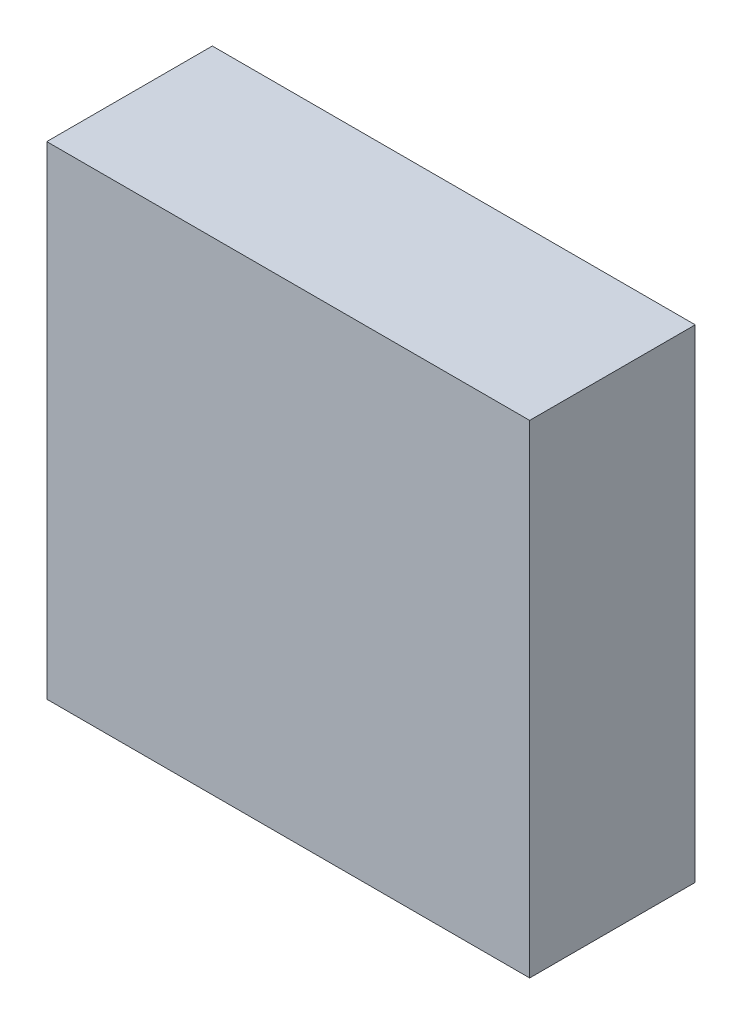
ISO-10303-21;
HEADER;
FILE_DESCRIPTION(('STEP AP214'),'2;1');
FILE_NAME('part.step','',(''),(''),'','','');
FILE_SCHEMA(('AUTOMOTIVE_DESIGN { 1 0 10303 214 1 1 1 1 }'));
ENDSEC;
DATA;
#1=APPLICATION_CONTEXT('core data for automotive mechanical design processes');
#2=APPLICATION_PROTOCOL_DEFINITION('international standard','automotive_design',2000,#1);
#3=PRODUCT_CONTEXT('',#1,'mechanical');
#4=PRODUCT('Part','Part','',(#3));
#5=PRODUCT_RELATED_PRODUCT_CATEGORY('part','',(#4));
#6=PRODUCT_DEFINITION_FORMATION('','',#4);
#7=PRODUCT_DEFINITION_CONTEXT('part definition',#1,'design');
#8=PRODUCT_DEFINITION('design','',#6,#7);
#9=PRODUCT_DEFINITION_SHAPE('','',#8);
#10=(LENGTH_UNIT() NAMED_UNIT(*) SI_UNIT(.MILLI.,.METRE.));
#11=(NAMED_UNIT(*) PLANE_ANGLE_UNIT() SI_UNIT($,.RADIAN.));
#12=(NAMED_UNIT(*) SI_UNIT($,.STERADIAN.) SOLID_ANGLE_UNIT());
#13=UNCERTAINTY_MEASURE_WITH_UNIT(LENGTH_MEASURE(1.E-05),#10,'distance_accuracy_value','');
#14=(GEOMETRIC_REPRESENTATION_CONTEXT(3) GLOBAL_UNCERTAINTY_ASSIGNED_CONTEXT((#13)) GLOBAL_UNIT_ASSIGNED_CONTEXT((#10,
#11,#12)) REPRESENTATION_CONTEXT('',''));
#15=CARTESIAN_POINT('',(0.,0.,0.));
#16=DIRECTION('',(0.,0.,1.));
#17=DIRECTION('',(1.,0.,0.));
#18=AXIS2_PLACEMENT_3D('',#15,#16,#17);
#19=CARTESIAN_POINT('',(-1.75,-1.75,1.2));
#20=DIRECTION('',(1.,0.,0.));
#21=DIRECTION('',(0.,0.,-1.));
#22=AXIS2_PLACEMENT_3D('',#19,#20,#21);
#23=PLANE('',#22);
#24=DIRECTION('',(0.,-1.,0.));
#25=VECTOR('',#24,1.);
#26=CARTESIAN_POINT('',(-1.75,-1.75,0.));
#27=LINE('',#26,#25);
#28=CARTESIAN_POINT('',(-1.75,1.75,0.));
#29=VERTEX_POINT('',#28);
#30=CARTESIAN_POINT('',(-1.75,-1.75,0.));
#31=VERTEX_POINT('',#30);
#32=EDGE_CURVE('E97',#29,#31,#27,.T.);
#33=ORIENTED_EDGE('',*,*,#32,.T.);
#34=DIRECTION('',(0.,0.,-1.));
#35=VECTOR('',#34,1.);
#36=CARTESIAN_POINT('',(-1.75,-1.75,1.2));
#37=LINE('',#36,#35);
#38=CARTESIAN_POINT('',(-1.75,-1.75,1.2));
#39=VERTEX_POINT('',#38);
#40=EDGE_CURVE('E11',#39,#31,#37,.T.);
#41=ORIENTED_EDGE('',*,*,#40,.F.);
#42=DIRECTION('',(0.,-1.,0.));
#43=VECTOR('',#42,1.);
#44=CARTESIAN_POINT('',(-1.75,-1.75,1.2));
#45=LINE('',#44,#43);
#46=CARTESIAN_POINT('',(-1.75,1.75,1.2));
#47=VERTEX_POINT('',#46);
#48=EDGE_CURVE('E85',#47,#39,#45,.T.);
#49=ORIENTED_EDGE('',*,*,#48,.F.);
#50=DIRECTION('',(0.,0.,-1.));
#51=VECTOR('',#50,1.);
#52=CARTESIAN_POINT('',(-1.75,1.75,1.2));
#53=LINE('',#52,#51);
#54=EDGE_CURVE('E93',#47,#29,#53,.T.);
#55=ORIENTED_EDGE('',*,*,#54,.T.);
#56=EDGE_LOOP('',(#33,#41,#49,#55));
#57=FACE_BOUND('',#56,.T.);
#58=ADVANCED_FACE('F34',(#57),#23,.F.);
#59=CARTESIAN_POINT('',(1.75,-1.75,1.2));
#60=DIRECTION('',(0.,1.,0.));
#61=DIRECTION('',(0.,0.,1.));
#62=AXIS2_PLACEMENT_3D('',#59,#60,#61);
#63=PLANE('',#62);
#64=DIRECTION('',(1.,0.,0.));
#65=VECTOR('',#64,1.);
#66=CARTESIAN_POINT('',(1.75,-1.75,0.));
#67=LINE('',#66,#65);
#68=CARTESIAN_POINT('',(1.75,-1.75,0.));
#69=VERTEX_POINT('',#68);
#70=EDGE_CURVE('E89',#31,#69,#67,.T.);
#71=ORIENTED_EDGE('',*,*,#70,.T.);
#72=DIRECTION('',(0.,0.,-1.));
#73=VECTOR('',#72,1.);
#74=CARTESIAN_POINT('',(1.75,-1.75,1.2));
#75=LINE('',#74,#73);
#76=CARTESIAN_POINT('',(1.75,-1.75,1.2));
#77=VERTEX_POINT('',#76);
#78=EDGE_CURVE('E42',#77,#69,#75,.T.);
#79=ORIENTED_EDGE('',*,*,#78,.F.);
#80=DIRECTION('',(1.,0.,0.));
#81=VECTOR('',#80,1.);
#82=CARTESIAN_POINT('',(1.75,-1.75,1.2));
#83=LINE('',#82,#81);
#84=EDGE_CURVE('E80',#39,#77,#83,.T.);
#85=ORIENTED_EDGE('',*,*,#84,.F.);
#86=ORIENTED_EDGE('',*,*,#40,.T.);
#87=EDGE_LOOP('',(#71,#79,#85,#86));
#88=FACE_BOUND('',#87,.T.);
#89=ADVANCED_FACE('F88',(#88),#63,.F.);
#90=CARTESIAN_POINT('',(1.75,1.75,1.2));
#91=DIRECTION('',(-1.,0.,0.));
#92=DIRECTION('',(0.,0.,1.));
#93=AXIS2_PLACEMENT_3D('',#90,#91,#92);
#94=PLANE('',#93);
#95=DIRECTION('',(0.,1.,0.));
#96=VECTOR('',#95,1.);
#97=CARTESIAN_POINT('',(1.75,1.75,0.));
#98=LINE('',#97,#96);
#99=CARTESIAN_POINT('',(1.75,1.75,0.));
#100=VERTEX_POINT('',#99);
#101=EDGE_CURVE('E67',#69,#100,#98,.T.);
#102=ORIENTED_EDGE('',*,*,#101,.T.);
#103=DIRECTION('',(0.,0.,-1.));
#104=VECTOR('',#103,1.);
#105=CARTESIAN_POINT('',(1.75,1.75,1.2));
#106=LINE('',#105,#104);
#107=CARTESIAN_POINT('',(1.75,1.75,1.2));
#108=VERTEX_POINT('',#107);
#109=EDGE_CURVE('E90',#108,#100,#106,.T.);
#110=ORIENTED_EDGE('',*,*,#109,.F.);
#111=DIRECTION('',(0.,1.,0.));
#112=VECTOR('',#111,1.);
#113=CARTESIAN_POINT('',(1.75,1.75,1.2));
#114=LINE('',#113,#112);
#115=EDGE_CURVE('E83',#77,#108,#114,.T.);
#116=ORIENTED_EDGE('',*,*,#115,.F.);
#117=ORIENTED_EDGE('',*,*,#78,.T.);
#118=EDGE_LOOP('',(#102,#110,#116,#117));
#119=FACE_BOUND('',#118,.T.);
#120=ADVANCED_FACE('F91',(#119),#94,.F.);
#121=CARTESIAN_POINT('',(-1.75,1.75,1.2));
#122=DIRECTION('',(0.,-1.,0.));
#123=DIRECTION('',(0.,0.,-1.));
#124=AXIS2_PLACEMENT_3D('',#121,#122,#123);
#125=PLANE('',#124);
#126=DIRECTION('',(-1.,0.,0.));
#127=VECTOR('',#126,1.);
#128=CARTESIAN_POINT('',(-1.75,1.75,0.));
#129=LINE('',#128,#127);
#130=EDGE_CURVE('E73',#100,#29,#129,.T.);
#131=ORIENTED_EDGE('',*,*,#130,.T.);
#132=ORIENTED_EDGE('',*,*,#54,.F.);
#133=DIRECTION('',(-1.,0.,0.));
#134=VECTOR('',#133,1.);
#135=CARTESIAN_POINT('',(-1.75,1.75,1.2));
#136=LINE('',#135,#134);
#137=EDGE_CURVE('E50',#108,#47,#136,.T.);
#138=ORIENTED_EDGE('',*,*,#137,.F.);
#139=ORIENTED_EDGE('',*,*,#109,.T.);
#140=EDGE_LOOP('',(#131,#132,#138,#139));
#141=FACE_BOUND('',#140,.T.);
#142=ADVANCED_FACE('F104',(#141),#125,.F.);
#143=CARTESIAN_POINT('',(0.,0.,1.2));
#144=DIRECTION('',(0.,0.,-1.));
#145=DIRECTION('',(-1.,0.,0.));
#146=AXIS2_PLACEMENT_3D('',#143,#144,#145);
#147=PLANE('',#146);
#148=ORIENTED_EDGE('',*,*,#48,.T.);
#149=ORIENTED_EDGE('',*,*,#84,.T.);
#150=ORIENTED_EDGE('',*,*,#115,.T.);
#151=ORIENTED_EDGE('',*,*,#137,.T.);
#152=EDGE_LOOP('',(#148,#149,#150,#151));
#153=FACE_BOUND('',#152,.T.);
#154=ADVANCED_FACE('F81',(#153),#147,.F.);
#155=CARTESIAN_POINT('',(0.,0.,0.));
#156=DIRECTION('',(0.,0.,-1.));
#157=DIRECTION('',(-1.,0.,0.));
#158=AXIS2_PLACEMENT_3D('',#155,#156,#157);
#159=PLANE('',#158);
#160=ORIENTED_EDGE('',*,*,#32,.F.);
#161=ORIENTED_EDGE('',*,*,#130,.F.);
#162=ORIENTED_EDGE('',*,*,#101,.F.);
#163=ORIENTED_EDGE('',*,*,#70,.F.);
#164=EDGE_LOOP('',(#160,#161,#162,#163));
#165=FACE_BOUND('',#164,.T.);
#166=ADVANCED_FACE('F107',(#165),#159,.T.);
#167=CLOSED_SHELL('',(#58,#89,#120,#142,#154,#166));
#168=MANIFOLD_SOLID_BREP('B2',#167);
#169=ADVANCED_BREP_SHAPE_REPRESENTATION('',(#18,#168),#14);
#170=SHAPE_DEFINITION_REPRESENTATION(#9,#169);
ENDSEC;
END-ISO-10303-21;
